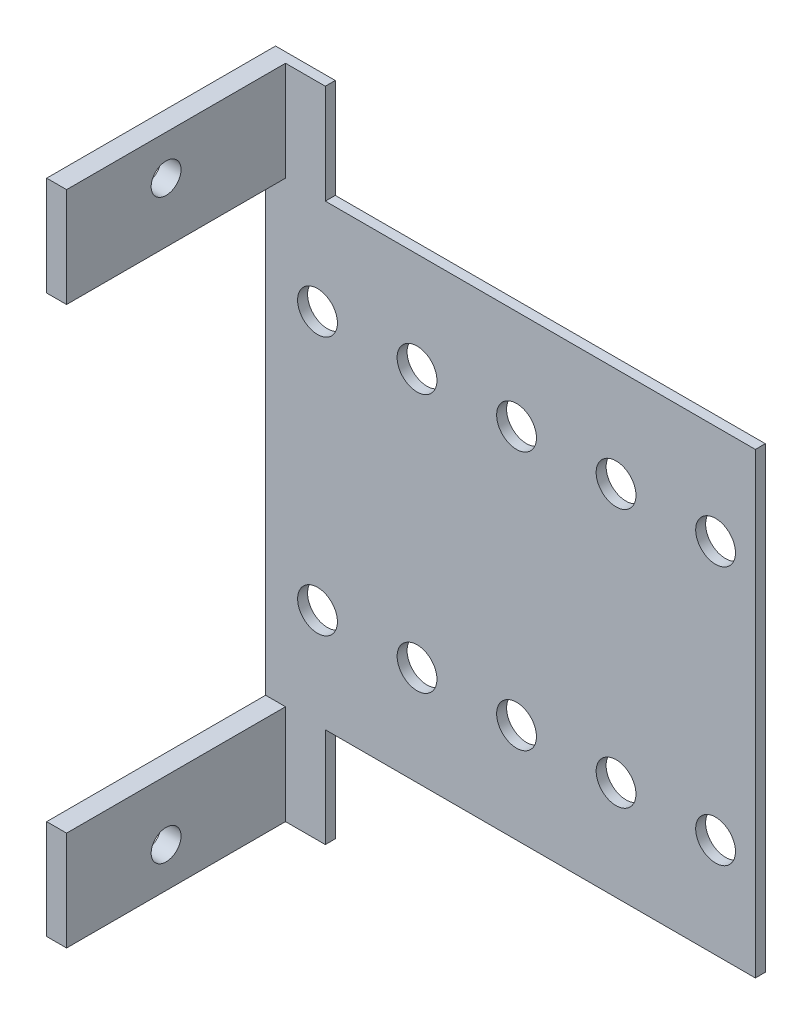
ISO-10303-21;
HEADER;
FILE_DESCRIPTION(('STEP AP214'),'2;1');
FILE_NAME('part.step','',(''),(''),'','','');
FILE_SCHEMA(('AUTOMOTIVE_DESIGN { 1 0 10303 214 1 1 1 1 }'));
ENDSEC;
DATA;
#1=APPLICATION_CONTEXT('core data for automotive mechanical design processes');
#2=APPLICATION_PROTOCOL_DEFINITION('international standard','automotive_design',2000,#1);
#3=PRODUCT_CONTEXT('',#1,'mechanical');
#4=PRODUCT('Part','Part','',(#3));
#5=PRODUCT_RELATED_PRODUCT_CATEGORY('part','',(#4));
#6=PRODUCT_DEFINITION_FORMATION('','',#4);
#7=PRODUCT_DEFINITION_CONTEXT('part definition',#1,'design');
#8=PRODUCT_DEFINITION('design','',#6,#7);
#9=PRODUCT_DEFINITION_SHAPE('','',#8);
#10=(LENGTH_UNIT() NAMED_UNIT(*) SI_UNIT(.MILLI.,.METRE.));
#11=(NAMED_UNIT(*) PLANE_ANGLE_UNIT() SI_UNIT($,.RADIAN.));
#12=(NAMED_UNIT(*) SI_UNIT($,.STERADIAN.) SOLID_ANGLE_UNIT());
#13=UNCERTAINTY_MEASURE_WITH_UNIT(LENGTH_MEASURE(1.E-05),#10,'distance_accuracy_value','');
#14=(GEOMETRIC_REPRESENTATION_CONTEXT(3) GLOBAL_UNCERTAINTY_ASSIGNED_CONTEXT((#13)) GLOBAL_UNIT_ASSIGNED_CONTEXT((#10,
#11,#12)) REPRESENTATION_CONTEXT('',''));
#15=CARTESIAN_POINT('',(0.,0.,0.));
#16=DIRECTION('',(0.,0.,1.));
#17=DIRECTION('',(1.,0.,0.));
#18=AXIS2_PLACEMENT_3D('',#15,#16,#17);
#19=CARTESIAN_POINT('',(0.,0.,0.5));
#20=DIRECTION('',(0.,0.,1.));
#21=DIRECTION('',(1.,0.,0.));
#22=AXIS2_PLACEMENT_3D('',#19,#20,#21);
#23=PLANE('',#22);
#24=CARTESIAN_POINT('',(22.6081435007467,23.,0.5));
#25=DIRECTION('',(0.,0.,1.));
#26=DIRECTION('',(-1.,0.,0.));
#27=AXIS2_PLACEMENT_3D('',#24,#25,#26);
#28=CIRCLE('',#27,1.);
#29=CARTESIAN_POINT('',(21.6081435007467,23.,0.5));
#30=VERTEX_POINT('',#29);
#31=EDGE_CURVE('E223',#30,#30,#28,.T.);
#32=ORIENTED_EDGE('',*,*,#31,.F.);
#33=EDGE_LOOP('',(#32));
#34=FACE_BOUND('',#33,.T.);
#35=CARTESIAN_POINT('',(17.6081435007467,23.,0.5));
#36=DIRECTION('',(0.,0.,1.));
#37=DIRECTION('',(-1.,0.,0.));
#38=AXIS2_PLACEMENT_3D('',#35,#36,#37);
#39=CIRCLE('',#38,1.);
#40=CARTESIAN_POINT('',(16.6081435007467,23.,0.5));
#41=VERTEX_POINT('',#40);
#42=EDGE_CURVE('E220',#41,#41,#39,.T.);
#43=ORIENTED_EDGE('',*,*,#42,.F.);
#44=EDGE_LOOP('',(#43));
#45=FACE_BOUND('',#44,.T.);
#46=CARTESIAN_POINT('',(12.6081435007467,23.0000000000001,0.5));
#47=DIRECTION('',(0.,0.,1.));
#48=DIRECTION('',(-1.,0.,0.));
#49=AXIS2_PLACEMENT_3D('',#46,#47,#48);
#50=CIRCLE('',#49,1.);
#51=CARTESIAN_POINT('',(11.6081435007467,23.0000000000001,0.5));
#52=VERTEX_POINT('',#51);
#53=EDGE_CURVE('E216',#52,#52,#50,.T.);
#54=ORIENTED_EDGE('',*,*,#53,.F.);
#55=EDGE_LOOP('',(#54));
#56=FACE_BOUND('',#55,.T.);
#57=CARTESIAN_POINT('',(7.60814350074672,23.0000000000001,0.5));
#58=DIRECTION('',(0.,0.,1.));
#59=DIRECTION('',(-1.,0.,0.));
#60=AXIS2_PLACEMENT_3D('',#57,#58,#59);
#61=CIRCLE('',#60,1.);
#62=CARTESIAN_POINT('',(6.60814350074672,23.0000000000001,0.5));
#63=VERTEX_POINT('',#62);
#64=EDGE_CURVE('E212',#63,#63,#61,.T.);
#65=ORIENTED_EDGE('',*,*,#64,.F.);
#66=EDGE_LOOP('',(#65));
#67=FACE_BOUND('',#66,.T.);
#68=CARTESIAN_POINT('',(2.60814350074672,9.99999999999986,0.5));
#69=DIRECTION('',(0.,0.,1.));
#70=DIRECTION('',(1.,0.,0.));
#71=AXIS2_PLACEMENT_3D('',#68,#69,#70);
#72=CIRCLE('',#71,1.);
#73=CARTESIAN_POINT('',(3.60814350074672,9.99999999999986,0.5));
#74=VERTEX_POINT('',#73);
#75=EDGE_CURVE('E208',#74,#74,#72,.T.);
#76=ORIENTED_EDGE('',*,*,#75,.F.);
#77=EDGE_LOOP('',(#76));
#78=FACE_BOUND('',#77,.T.);
#79=CARTESIAN_POINT('',(7.60814350074672,9.9999999999999,0.5));
#80=DIRECTION('',(0.,0.,1.));
#81=DIRECTION('',(1.,0.,0.));
#82=AXIS2_PLACEMENT_3D('',#79,#80,#81);
#83=CIRCLE('',#82,1.);
#84=CARTESIAN_POINT('',(8.60814350074672,9.9999999999999,0.5));
#85=VERTEX_POINT('',#84);
#86=EDGE_CURVE('E204',#85,#85,#83,.T.);
#87=ORIENTED_EDGE('',*,*,#86,.F.);
#88=EDGE_LOOP('',(#87));
#89=FACE_BOUND('',#88,.T.);
#90=CARTESIAN_POINT('',(12.6081435007467,9.99999999999993,0.5));
#91=DIRECTION('',(0.,0.,1.));
#92=DIRECTION('',(1.,0.,0.));
#93=AXIS2_PLACEMENT_3D('',#90,#91,#92);
#94=CIRCLE('',#93,1.);
#95=CARTESIAN_POINT('',(13.6081435007467,9.99999999999993,0.5));
#96=VERTEX_POINT('',#95);
#97=EDGE_CURVE('E200',#96,#96,#94,.T.);
#98=ORIENTED_EDGE('',*,*,#97,.F.);
#99=EDGE_LOOP('',(#98));
#100=FACE_BOUND('',#99,.T.);
#101=CARTESIAN_POINT('',(17.6081435007467,9.99999999999997,0.5));
#102=DIRECTION('',(0.,0.,1.));
#103=DIRECTION('',(1.,0.,0.));
#104=AXIS2_PLACEMENT_3D('',#101,#102,#103);
#105=CIRCLE('',#104,1.);
#106=CARTESIAN_POINT('',(18.6081435007467,9.99999999999997,0.5));
#107=VERTEX_POINT('',#106);
#108=EDGE_CURVE('E196',#107,#107,#105,.T.);
#109=ORIENTED_EDGE('',*,*,#108,.F.);
#110=EDGE_LOOP('',(#109));
#111=FACE_BOUND('',#110,.T.);
#112=CARTESIAN_POINT('',(2.60814350074672,23.0000000000001,0.5));
#113=DIRECTION('',(0.,0.,1.));
#114=DIRECTION('',(-1.,0.,0.));
#115=AXIS2_PLACEMENT_3D('',#112,#113,#114);
#116=CIRCLE('',#115,1.);
#117=CARTESIAN_POINT('',(1.60814350074672,23.0000000000001,0.5));
#118=VERTEX_POINT('',#117);
#119=EDGE_CURVE('E192',#118,#118,#116,.T.);
#120=ORIENTED_EDGE('',*,*,#119,.F.);
#121=EDGE_LOOP('',(#120));
#122=FACE_BOUND('',#121,.T.);
#123=CARTESIAN_POINT('',(22.6081435007467,10.,0.5));
#124=DIRECTION('',(0.,0.,1.));
#125=DIRECTION('',(1.,0.,0.));
#126=AXIS2_PLACEMENT_3D('',#123,#124,#125);
#127=CIRCLE('',#126,1.);
#128=CARTESIAN_POINT('',(23.6081435007467,10.,0.5));
#129=VERTEX_POINT('',#128);
#130=EDGE_CURVE('E188',#129,#129,#127,.T.);
#131=ORIENTED_EDGE('',*,*,#130,.F.);
#132=EDGE_LOOP('',(#131));
#133=FACE_BOUND('',#132,.T.);
#134=DIRECTION('',(1.,0.,0.));
#135=VECTOR('',#134,1.);
#136=CARTESIAN_POINT('',(0.,5.,0.5));
#137=LINE('',#136,#135);
#138=CARTESIAN_POINT('',(0.,5.,0.5));
#139=VERTEX_POINT('',#138);
#140=CARTESIAN_POINT('',(1.,5.,0.5));
#141=VERTEX_POINT('',#140);
#142=EDGE_CURVE('E51',#139,#141,#137,.T.);
#143=ORIENTED_EDGE('',*,*,#142,.T.);
#144=DIRECTION('',(0.,1.,0.));
#145=VECTOR('',#144,1.);
#146=CARTESIAN_POINT('',(1.,0.,0.5));
#147=LINE('',#146,#145);
#148=CARTESIAN_POINT('',(1.,0.,0.5));
#149=VERTEX_POINT('',#148);
#150=EDGE_CURVE('E56',#149,#141,#147,.T.);
#151=ORIENTED_EDGE('',*,*,#150,.F.);
#152=DIRECTION('',(1.,0.,0.));
#153=VECTOR('',#152,1.);
#154=CARTESIAN_POINT('',(0.,0.,0.5));
#155=LINE('',#154,#153);
#156=CARTESIAN_POINT('',(3.,0.,0.5));
#157=VERTEX_POINT('',#156);
#158=EDGE_CURVE('E158',#149,#157,#155,.T.);
#159=ORIENTED_EDGE('',*,*,#158,.T.);
#160=DIRECTION('',(0.,1.,0.));
#161=VECTOR('',#160,1.);
#162=CARTESIAN_POINT('',(3.,0.,0.5));
#163=LINE('',#162,#161);
#164=CARTESIAN_POINT('',(3.,5.,0.5));
#165=VERTEX_POINT('',#164);
#166=EDGE_CURVE('E412',#157,#165,#163,.T.);
#167=ORIENTED_EDGE('',*,*,#166,.T.);
#168=DIRECTION('',(1.,0.,0.));
#169=VECTOR('',#168,1.);
#170=CARTESIAN_POINT('',(3.,5.,0.5));
#171=LINE('',#170,#169);
#172=CARTESIAN_POINT('',(24.6081435007467,5.,0.5));
#173=VERTEX_POINT('',#172);
#174=EDGE_CURVE('E336',#165,#173,#171,.T.);
#175=ORIENTED_EDGE('',*,*,#174,.T.);
#176=DIRECTION('',(0.,1.,0.));
#177=VECTOR('',#176,1.);
#178=CARTESIAN_POINT('',(24.6081435007467,28.,0.5));
#179=LINE('',#178,#177);
#180=CARTESIAN_POINT('',(24.6081435007467,28.,0.5));
#181=VERTEX_POINT('',#180);
#182=EDGE_CURVE('E410',#173,#181,#179,.T.);
#183=ORIENTED_EDGE('',*,*,#182,.T.);
#184=DIRECTION('',(-1.,0.,0.));
#185=VECTOR('',#184,1.);
#186=CARTESIAN_POINT('',(3.,28.,0.5));
#187=LINE('',#186,#185);
#188=CARTESIAN_POINT('',(3.,28.,0.5));
#189=VERTEX_POINT('',#188);
#190=EDGE_CURVE('E407',#181,#189,#187,.T.);
#191=ORIENTED_EDGE('',*,*,#190,.T.);
#192=DIRECTION('',(0.,1.,0.));
#193=VECTOR('',#192,1.);
#194=CARTESIAN_POINT('',(3.,33.,0.5));
#195=LINE('',#194,#193);
#196=CARTESIAN_POINT('',(3.,33.,0.5));
#197=VERTEX_POINT('',#196);
#198=EDGE_CURVE('E372',#189,#197,#195,.T.);
#199=ORIENTED_EDGE('',*,*,#198,.T.);
#200=DIRECTION('',(-1.,0.,0.));
#201=VECTOR('',#200,1.);
#202=CARTESIAN_POINT('',(0.,33.,0.5));
#203=LINE('',#202,#201);
#204=CARTESIAN_POINT('',(1.,33.,0.5));
#205=VERTEX_POINT('',#204);
#206=EDGE_CURVE('E369',#197,#205,#203,.T.);
#207=ORIENTED_EDGE('',*,*,#206,.T.);
#208=DIRECTION('',(0.,-1.,0.));
#209=VECTOR('',#208,1.);
#210=CARTESIAN_POINT('',(1.,0.,0.5));
#211=LINE('',#210,#209);
#212=CARTESIAN_POINT('',(1.,28.,0.5));
#213=VERTEX_POINT('',#212);
#214=EDGE_CURVE('E159',#205,#213,#211,.T.);
#215=ORIENTED_EDGE('',*,*,#214,.T.);
#216=DIRECTION('',(1.,0.,0.));
#217=VECTOR('',#216,1.);
#218=CARTESIAN_POINT('',(0.,28.,0.5));
#219=LINE('',#218,#217);
#220=CARTESIAN_POINT('',(0.,28.,0.5));
#221=VERTEX_POINT('',#220);
#222=EDGE_CURVE('E161',#221,#213,#219,.T.);
#223=ORIENTED_EDGE('',*,*,#222,.F.);
#224=DIRECTION('',(0.,-1.,0.));
#225=VECTOR('',#224,1.);
#226=CARTESIAN_POINT('',(0.,0.,0.5));
#227=LINE('',#226,#225);
#228=EDGE_CURVE('E265',#221,#139,#227,.T.);
#229=ORIENTED_EDGE('',*,*,#228,.T.);
#230=EDGE_LOOP('',(#143,#151,#159,#167,#175,#183,#191,#199,#207,#215,#223,#229));
#231=FACE_BOUND('',#230,.T.);
#232=ADVANCED_FACE('F34',(#34,#45,#56,#67,#78,#89,#100,#111,#122,#133,#231),#23,.T.);
#233=CARTESIAN_POINT('',(0.,0.,0.5));
#234=DIRECTION('',(0.,1.,0.));
#235=DIRECTION('',(0.,0.,1.));
#236=AXIS2_PLACEMENT_3D('',#233,#234,#235);
#237=PLANE('',#236);
#238=DIRECTION('',(1.,0.,0.));
#239=VECTOR('',#238,1.);
#240=CARTESIAN_POINT('',(0.,0.,0.));
#241=LINE('',#240,#239);
#242=CARTESIAN_POINT('',(0.,0.,0.));
#243=VERTEX_POINT('',#242);
#244=CARTESIAN_POINT('',(3.,0.,0.));
#245=VERTEX_POINT('',#244);
#246=EDGE_CURVE('E332',#243,#245,#241,.T.);
#247=ORIENTED_EDGE('',*,*,#246,.T.);
#248=DIRECTION('',(0.,0.,-1.));
#249=VECTOR('',#248,1.);
#250=CARTESIAN_POINT('',(3.,0.,0.5));
#251=LINE('',#250,#249);
#252=EDGE_CURVE('E11',#157,#245,#251,.T.);
#253=ORIENTED_EDGE('',*,*,#252,.F.);
#254=ORIENTED_EDGE('',*,*,#158,.F.);
#255=DIRECTION('',(0.,0.,-1.));
#256=VECTOR('',#255,1.);
#257=CARTESIAN_POINT('',(1.,0.,11.5));
#258=LINE('',#257,#256);
#259=CARTESIAN_POINT('',(1.,0.,11.5));
#260=VERTEX_POINT('',#259);
#261=EDGE_CURVE('E140',#260,#149,#258,.T.);
#262=ORIENTED_EDGE('',*,*,#261,.F.);
#263=DIRECTION('',(1.,0.,0.));
#264=VECTOR('',#263,1.);
#265=CARTESIAN_POINT('',(0.,0.,11.5));
#266=LINE('',#265,#264);
#267=CARTESIAN_POINT('',(0.,0.,11.5));
#268=VERTEX_POINT('',#267);
#269=EDGE_CURVE('E146',#268,#260,#266,.T.);
#270=ORIENTED_EDGE('',*,*,#269,.F.);
#271=DIRECTION('',(0.,0.,-1.));
#272=VECTOR('',#271,1.);
#273=CARTESIAN_POINT('',(0.,0.,0.5));
#274=LINE('',#273,#272);
#275=EDGE_CURVE('E354',#268,#243,#274,.T.);
#276=ORIENTED_EDGE('',*,*,#275,.T.);
#277=EDGE_LOOP('',(#247,#253,#254,#262,#270,#276));
#278=FACE_BOUND('',#277,.T.);
#279=ADVANCED_FACE('F36',(#278),#237,.F.);
#280=CARTESIAN_POINT('',(3.,0.,0.5));
#281=DIRECTION('',(-1.,0.,0.));
#282=DIRECTION('',(0.,0.,1.));
#283=AXIS2_PLACEMENT_3D('',#280,#281,#282);
#284=PLANE('',#283);
#285=DIRECTION('',(0.,1.,0.));
#286=VECTOR('',#285,1.);
#287=CARTESIAN_POINT('',(3.,0.,0.));
#288=LINE('',#287,#286);
#289=CARTESIAN_POINT('',(3.,5.,0.));
#290=VERTEX_POINT('',#289);
#291=EDGE_CURVE('E324',#245,#290,#288,.T.);
#292=ORIENTED_EDGE('',*,*,#291,.T.);
#293=DIRECTION('',(0.,0.,-1.));
#294=VECTOR('',#293,1.);
#295=CARTESIAN_POINT('',(3.,5.,0.5));
#296=LINE('',#295,#294);
#297=EDGE_CURVE('E43',#165,#290,#296,.T.);
#298=ORIENTED_EDGE('',*,*,#297,.F.);
#299=ORIENTED_EDGE('',*,*,#166,.F.);
#300=ORIENTED_EDGE('',*,*,#252,.T.);
#301=EDGE_LOOP('',(#292,#298,#299,#300));
#302=FACE_BOUND('',#301,.T.);
#303=ADVANCED_FACE('F286',(#302),#284,.F.);
#304=CARTESIAN_POINT('',(3.,5.,0.5));
#305=DIRECTION('',(0.,1.,0.));
#306=DIRECTION('',(0.,0.,1.));
#307=AXIS2_PLACEMENT_3D('',#304,#305,#306);
#308=PLANE('',#307);
#309=DIRECTION('',(1.,0.,0.));
#310=VECTOR('',#309,1.);
#311=CARTESIAN_POINT('',(3.,5.,0.));
#312=LINE('',#311,#310);
#313=CARTESIAN_POINT('',(24.6081435007467,5.,0.));
#314=VERTEX_POINT('',#313);
#315=EDGE_CURVE('E331',#290,#314,#312,.T.);
#316=ORIENTED_EDGE('',*,*,#315,.T.);
#317=DIRECTION('',(0.,0.,-1.));
#318=VECTOR('',#317,1.);
#319=CARTESIAN_POINT('',(24.6081435007467,5.,0.5));
#320=LINE('',#319,#318);
#321=EDGE_CURVE('E337',#173,#314,#320,.T.);
#322=ORIENTED_EDGE('',*,*,#321,.F.);
#323=ORIENTED_EDGE('',*,*,#174,.F.);
#324=ORIENTED_EDGE('',*,*,#297,.T.);
#325=EDGE_LOOP('',(#316,#322,#323,#324));
#326=FACE_BOUND('',#325,.T.);
#327=ADVANCED_FACE('F315',(#326),#308,.F.);
#328=CARTESIAN_POINT('',(24.6081435007467,28.,0.5));
#329=DIRECTION('',(-1.,0.,0.));
#330=DIRECTION('',(0.,0.,1.));
#331=AXIS2_PLACEMENT_3D('',#328,#329,#330);
#332=PLANE('',#331);
#333=DIRECTION('',(0.,1.,0.));
#334=VECTOR('',#333,1.);
#335=CARTESIAN_POINT('',(24.6081435007467,28.,0.));
#336=LINE('',#335,#334);
#337=CARTESIAN_POINT('',(24.6081435007467,28.,0.));
#338=VERTEX_POINT('',#337);
#339=EDGE_CURVE('E341',#314,#338,#336,.T.);
#340=ORIENTED_EDGE('',*,*,#339,.T.);
#341=DIRECTION('',(0.,0.,-1.));
#342=VECTOR('',#341,1.);
#343=CARTESIAN_POINT('',(24.6081435007467,28.,0.5));
#344=LINE('',#343,#342);
#345=EDGE_CURVE('E365',#181,#338,#344,.T.);
#346=ORIENTED_EDGE('',*,*,#345,.F.);
#347=ORIENTED_EDGE('',*,*,#182,.F.);
#348=ORIENTED_EDGE('',*,*,#321,.T.);
#349=EDGE_LOOP('',(#340,#346,#347,#348));
#350=FACE_BOUND('',#349,.T.);
#351=ADVANCED_FACE('F311',(#350),#332,.F.);
#352=CARTESIAN_POINT('',(3.,28.,0.5));
#353=DIRECTION('',(0.,-1.,0.));
#354=DIRECTION('',(0.,0.,-1.));
#355=AXIS2_PLACEMENT_3D('',#352,#353,#354);
#356=PLANE('',#355);
#357=DIRECTION('',(-1.,0.,0.));
#358=VECTOR('',#357,1.);
#359=CARTESIAN_POINT('',(3.,28.,0.));
#360=LINE('',#359,#358);
#361=CARTESIAN_POINT('',(3.,28.,0.));
#362=VERTEX_POINT('',#361);
#363=EDGE_CURVE('E343',#338,#362,#360,.T.);
#364=ORIENTED_EDGE('',*,*,#363,.T.);
#365=DIRECTION('',(0.,0.,-1.));
#366=VECTOR('',#365,1.);
#367=CARTESIAN_POINT('',(3.,28.,0.5));
#368=LINE('',#367,#366);
#369=EDGE_CURVE('E362',#189,#362,#368,.T.);
#370=ORIENTED_EDGE('',*,*,#369,.F.);
#371=ORIENTED_EDGE('',*,*,#190,.F.);
#372=ORIENTED_EDGE('',*,*,#345,.T.);
#373=EDGE_LOOP('',(#364,#370,#371,#372));
#374=FACE_BOUND('',#373,.T.);
#375=ADVANCED_FACE('F307',(#374),#356,.F.);
#376=CARTESIAN_POINT('',(3.,33.,0.5));
#377=DIRECTION('',(-1.,0.,0.));
#378=DIRECTION('',(0.,0.,1.));
#379=AXIS2_PLACEMENT_3D('',#376,#377,#378);
#380=PLANE('',#379);
#381=DIRECTION('',(0.,1.,0.));
#382=VECTOR('',#381,1.);
#383=CARTESIAN_POINT('',(3.,33.,0.));
#384=LINE('',#383,#382);
#385=CARTESIAN_POINT('',(3.,33.,0.));
#386=VERTEX_POINT('',#385);
#387=EDGE_CURVE('E348',#362,#386,#384,.T.);
#388=ORIENTED_EDGE('',*,*,#387,.T.);
#389=DIRECTION('',(0.,0.,-1.));
#390=VECTOR('',#389,1.);
#391=CARTESIAN_POINT('',(3.,33.,0.5));
#392=LINE('',#391,#390);
#393=EDGE_CURVE('E359',#197,#386,#392,.T.);
#394=ORIENTED_EDGE('',*,*,#393,.F.);
#395=ORIENTED_EDGE('',*,*,#198,.F.);
#396=ORIENTED_EDGE('',*,*,#369,.T.);
#397=EDGE_LOOP('',(#388,#394,#395,#396));
#398=FACE_BOUND('',#397,.T.);
#399=ADVANCED_FACE('F303',(#398),#380,.F.);
#400=CARTESIAN_POINT('',(0.,33.,0.5));
#401=DIRECTION('',(0.,-1.,0.));
#402=DIRECTION('',(0.,0.,-1.));
#403=AXIS2_PLACEMENT_3D('',#400,#401,#402);
#404=PLANE('',#403);
#405=DIRECTION('',(-1.,0.,0.));
#406=VECTOR('',#405,1.);
#407=CARTESIAN_POINT('',(0.,33.,0.));
#408=LINE('',#407,#406);
#409=CARTESIAN_POINT('',(0.,33.,0.));
#410=VERTEX_POINT('',#409);
#411=EDGE_CURVE('E350',#386,#410,#408,.T.);
#412=ORIENTED_EDGE('',*,*,#411,.T.);
#413=DIRECTION('',(0.,0.,-1.));
#414=VECTOR('',#413,1.);
#415=CARTESIAN_POINT('',(0.,33.,0.5));
#416=LINE('',#415,#414);
#417=CARTESIAN_POINT('',(0.,33.,11.5));
#418=VERTEX_POINT('',#417);
#419=EDGE_CURVE('E356',#418,#410,#416,.T.);
#420=ORIENTED_EDGE('',*,*,#419,.F.);
#421=DIRECTION('',(-1.,0.,0.));
#422=VECTOR('',#421,1.);
#423=CARTESIAN_POINT('',(0.,33.,11.5));
#424=LINE('',#423,#422);
#425=CARTESIAN_POINT('',(1.,33.,11.5));
#426=VERTEX_POINT('',#425);
#427=EDGE_CURVE('E170',#426,#418,#424,.T.);
#428=ORIENTED_EDGE('',*,*,#427,.F.);
#429=DIRECTION('',(0.,0.,-1.));
#430=VECTOR('',#429,1.);
#431=CARTESIAN_POINT('',(1.,33.,11.5));
#432=LINE('',#431,#430);
#433=EDGE_CURVE('E379',#426,#205,#432,.T.);
#434=ORIENTED_EDGE('',*,*,#433,.T.);
#435=ORIENTED_EDGE('',*,*,#206,.F.);
#436=ORIENTED_EDGE('',*,*,#393,.T.);
#437=EDGE_LOOP('',(#412,#420,#428,#434,#435,#436));
#438=FACE_BOUND('',#437,.T.);
#439=ADVANCED_FACE('F299',(#438),#404,.F.);
#440=CARTESIAN_POINT('',(0.,0.,0.5));
#441=DIRECTION('',(1.,0.,0.));
#442=DIRECTION('',(0.,0.,-1.));
#443=AXIS2_PLACEMENT_3D('',#440,#441,#442);
#444=PLANE('',#443);
#445=CARTESIAN_POINT('',(0.,2.,6.5));
#446=DIRECTION('',(-1.,0.,0.));
#447=DIRECTION('',(0.,0.,-1.));
#448=AXIS2_PLACEMENT_3D('',#445,#446,#447);
#449=CIRCLE('',#448,0.75);
#450=CARTESIAN_POINT('',(0.,2.,5.75));
#451=VERTEX_POINT('',#450);
#452=EDGE_CURVE('E236',#451,#451,#449,.T.);
#453=ORIENTED_EDGE('',*,*,#452,.F.);
#454=EDGE_LOOP('',(#453));
#455=FACE_BOUND('',#454,.T.);
#456=CARTESIAN_POINT('',(0.,31.,6.5));
#457=DIRECTION('',(-1.,0.,0.));
#458=DIRECTION('',(0.,0.,1.));
#459=AXIS2_PLACEMENT_3D('',#456,#457,#458);
#460=CIRCLE('',#459,0.75);
#461=CARTESIAN_POINT('',(0.,31.,7.25));
#462=VERTEX_POINT('',#461);
#463=EDGE_CURVE('E226',#462,#462,#460,.T.);
#464=ORIENTED_EDGE('',*,*,#463,.F.);
#465=EDGE_LOOP('',(#464));
#466=FACE_BOUND('',#465,.T.);
#467=DIRECTION('',(0.,-1.,0.));
#468=VECTOR('',#467,1.);
#469=CARTESIAN_POINT('',(0.,0.,0.));
#470=LINE('',#469,#468);
#471=EDGE_CURVE('E352',#410,#243,#470,.T.);
#472=ORIENTED_EDGE('',*,*,#471,.T.);
#473=ORIENTED_EDGE('',*,*,#275,.F.);
#474=DIRECTION('',(0.,-1.,0.));
#475=VECTOR('',#474,1.);
#476=CARTESIAN_POINT('',(0.,0.,11.5));
#477=LINE('',#476,#475);
#478=CARTESIAN_POINT('',(0.,5.,11.5));
#479=VERTEX_POINT('',#478);
#480=EDGE_CURVE('E152',#479,#268,#477,.T.);
#481=ORIENTED_EDGE('',*,*,#480,.F.);
#482=DIRECTION('',(0.,0.,-1.));
#483=VECTOR('',#482,1.);
#484=CARTESIAN_POINT('',(0.,5.,11.5));
#485=LINE('',#484,#483);
#486=EDGE_CURVE('E163',#479,#139,#485,.T.);
#487=ORIENTED_EDGE('',*,*,#486,.T.);
#488=ORIENTED_EDGE('',*,*,#228,.F.);
#489=DIRECTION('',(0.,0.,-1.));
#490=VECTOR('',#489,1.);
#491=CARTESIAN_POINT('',(0.,28.,11.5));
#492=LINE('',#491,#490);
#493=CARTESIAN_POINT('',(0.,28.,11.5));
#494=VERTEX_POINT('',#493);
#495=EDGE_CURVE('E381',#494,#221,#492,.T.);
#496=ORIENTED_EDGE('',*,*,#495,.F.);
#497=DIRECTION('',(0.,-1.,0.));
#498=VECTOR('',#497,1.);
#499=CARTESIAN_POINT('',(0.,0.,11.5));
#500=LINE('',#499,#498);
#501=EDGE_CURVE('E173',#418,#494,#500,.T.);
#502=ORIENTED_EDGE('',*,*,#501,.F.);
#503=ORIENTED_EDGE('',*,*,#419,.T.);
#504=EDGE_LOOP('',(#472,#473,#481,#487,#488,#496,#502,#503));
#505=FACE_BOUND('',#504,.T.);
#506=ADVANCED_FACE('F263',(#455,#466,#505),#444,.F.);
#507=CARTESIAN_POINT('',(0.,0.,0.));
#508=DIRECTION('',(0.,0.,1.));
#509=DIRECTION('',(1.,0.,0.));
#510=AXIS2_PLACEMENT_3D('',#507,#508,#509);
#511=PLANE('',#510);
#512=CARTESIAN_POINT('',(22.6081435007467,23.,0.));
#513=DIRECTION('',(0.,0.,1.));
#514=DIRECTION('',(1.,0.,0.));
#515=AXIS2_PLACEMENT_3D('',#512,#513,#514);
#516=CIRCLE('',#515,1.);
#517=CARTESIAN_POINT('',(23.6081435007467,23.,0.));
#518=VERTEX_POINT('',#517);
#519=EDGE_CURVE('E221',#518,#518,#516,.T.);
#520=ORIENTED_EDGE('',*,*,#519,.T.);
#521=EDGE_LOOP('',(#520));
#522=FACE_BOUND('',#521,.T.);
#523=CARTESIAN_POINT('',(17.6081435007467,23.,0.));
#524=DIRECTION('',(0.,0.,1.));
#525=DIRECTION('',(1.,0.,0.));
#526=AXIS2_PLACEMENT_3D('',#523,#524,#525);
#527=CIRCLE('',#526,1.);
#528=CARTESIAN_POINT('',(18.6081435007467,23.,0.));
#529=VERTEX_POINT('',#528);
#530=EDGE_CURVE('E217',#529,#529,#527,.T.);
#531=ORIENTED_EDGE('',*,*,#530,.T.);
#532=EDGE_LOOP('',(#531));
#533=FACE_BOUND('',#532,.T.);
#534=CARTESIAN_POINT('',(12.6081435007467,23.0000000000001,0.));
#535=DIRECTION('',(0.,0.,1.));
#536=DIRECTION('',(1.,0.,0.));
#537=AXIS2_PLACEMENT_3D('',#534,#535,#536);
#538=CIRCLE('',#537,1.);
#539=CARTESIAN_POINT('',(13.6081435007467,23.0000000000001,0.));
#540=VERTEX_POINT('',#539);
#541=EDGE_CURVE('E213',#540,#540,#538,.T.);
#542=ORIENTED_EDGE('',*,*,#541,.T.);
#543=EDGE_LOOP('',(#542));
#544=FACE_BOUND('',#543,.T.);
#545=CARTESIAN_POINT('',(7.60814350074672,23.0000000000001,0.));
#546=DIRECTION('',(0.,0.,1.));
#547=DIRECTION('',(1.,0.,0.));
#548=AXIS2_PLACEMENT_3D('',#545,#546,#547);
#549=CIRCLE('',#548,1.);
#550=CARTESIAN_POINT('',(8.60814350074672,23.0000000000001,0.));
#551=VERTEX_POINT('',#550);
#552=EDGE_CURVE('E209',#551,#551,#549,.T.);
#553=ORIENTED_EDGE('',*,*,#552,.T.);
#554=EDGE_LOOP('',(#553));
#555=FACE_BOUND('',#554,.T.);
#556=CARTESIAN_POINT('',(2.60814350074672,9.99999999999986,0.));
#557=DIRECTION('',(0.,0.,1.));
#558=DIRECTION('',(1.,0.,0.));
#559=AXIS2_PLACEMENT_3D('',#556,#557,#558);
#560=CIRCLE('',#559,1.);
#561=CARTESIAN_POINT('',(3.60814350074672,9.99999999999986,0.));
#562=VERTEX_POINT('',#561);
#563=EDGE_CURVE('E205',#562,#562,#560,.T.);
#564=ORIENTED_EDGE('',*,*,#563,.T.);
#565=EDGE_LOOP('',(#564));
#566=FACE_BOUND('',#565,.T.);
#567=CARTESIAN_POINT('',(7.60814350074672,9.9999999999999,0.));
#568=DIRECTION('',(0.,0.,1.));
#569=DIRECTION('',(1.,0.,0.));
#570=AXIS2_PLACEMENT_3D('',#567,#568,#569);
#571=CIRCLE('',#570,1.);
#572=CARTESIAN_POINT('',(8.60814350074672,9.9999999999999,0.));
#573=VERTEX_POINT('',#572);
#574=EDGE_CURVE('E201',#573,#573,#571,.T.);
#575=ORIENTED_EDGE('',*,*,#574,.T.);
#576=EDGE_LOOP('',(#575));
#577=FACE_BOUND('',#576,.T.);
#578=CARTESIAN_POINT('',(12.6081435007467,9.99999999999993,0.));
#579=DIRECTION('',(0.,0.,1.));
#580=DIRECTION('',(1.,0.,0.));
#581=AXIS2_PLACEMENT_3D('',#578,#579,#580);
#582=CIRCLE('',#581,1.);
#583=CARTESIAN_POINT('',(13.6081435007467,9.99999999999993,0.));
#584=VERTEX_POINT('',#583);
#585=EDGE_CURVE('E197',#584,#584,#582,.T.);
#586=ORIENTED_EDGE('',*,*,#585,.T.);
#587=EDGE_LOOP('',(#586));
#588=FACE_BOUND('',#587,.T.);
#589=CARTESIAN_POINT('',(17.6081435007467,9.99999999999997,0.));
#590=DIRECTION('',(0.,0.,1.));
#591=DIRECTION('',(1.,0.,0.));
#592=AXIS2_PLACEMENT_3D('',#589,#590,#591);
#593=CIRCLE('',#592,1.);
#594=CARTESIAN_POINT('',(18.6081435007467,9.99999999999997,0.));
#595=VERTEX_POINT('',#594);
#596=EDGE_CURVE('E193',#595,#595,#593,.T.);
#597=ORIENTED_EDGE('',*,*,#596,.T.);
#598=EDGE_LOOP('',(#597));
#599=FACE_BOUND('',#598,.T.);
#600=CARTESIAN_POINT('',(2.60814350074672,23.0000000000001,0.));
#601=DIRECTION('',(0.,0.,1.));
#602=DIRECTION('',(1.,0.,0.));
#603=AXIS2_PLACEMENT_3D('',#600,#601,#602);
#604=CIRCLE('',#603,1.);
#605=CARTESIAN_POINT('',(3.60814350074672,23.0000000000001,0.));
#606=VERTEX_POINT('',#605);
#607=EDGE_CURVE('E189',#606,#606,#604,.T.);
#608=ORIENTED_EDGE('',*,*,#607,.T.);
#609=EDGE_LOOP('',(#608));
#610=FACE_BOUND('',#609,.T.);
#611=CARTESIAN_POINT('',(22.6081435007467,10.,0.));
#612=DIRECTION('',(0.,0.,1.));
#613=DIRECTION('',(1.,0.,0.));
#614=AXIS2_PLACEMENT_3D('',#611,#612,#613);
#615=CIRCLE('',#614,1.);
#616=CARTESIAN_POINT('',(23.6081435007467,10.,0.));
#617=VERTEX_POINT('',#616);
#618=EDGE_CURVE('E185',#617,#617,#615,.T.);
#619=ORIENTED_EDGE('',*,*,#618,.T.);
#620=EDGE_LOOP('',(#619));
#621=FACE_BOUND('',#620,.T.);
#622=ORIENTED_EDGE('',*,*,#246,.F.);
#623=ORIENTED_EDGE('',*,*,#471,.F.);
#624=ORIENTED_EDGE('',*,*,#411,.F.);
#625=ORIENTED_EDGE('',*,*,#387,.F.);
#626=ORIENTED_EDGE('',*,*,#363,.F.);
#627=ORIENTED_EDGE('',*,*,#339,.F.);
#628=ORIENTED_EDGE('',*,*,#315,.F.);
#629=ORIENTED_EDGE('',*,*,#291,.F.);
#630=EDGE_LOOP('',(#622,#623,#624,#625,#626,#627,#628,#629));
#631=FACE_BOUND('',#630,.T.);
#632=ADVANCED_FACE('F293',(#522,#533,#544,#555,#566,#577,#588,#599,#610,#621,#631),#511,.F.);
#633=CARTESIAN_POINT('',(1.,0.,11.5));
#634=DIRECTION('',(1.,0.,0.));
#635=DIRECTION('',(0.,1.,0.));
#636=AXIS2_PLACEMENT_3D('',#633,#634,#635);
#637=PLANE('',#636);
#638=CARTESIAN_POINT('',(1.,31.,6.5));
#639=DIRECTION('',(1.,0.,0.));
#640=DIRECTION('',(0.,1.,0.));
#641=AXIS2_PLACEMENT_3D('',#638,#639,#640);
#642=CIRCLE('',#641,0.75);
#643=CARTESIAN_POINT('',(1.,31.75,6.5));
#644=VERTEX_POINT('',#643);
#645=EDGE_CURVE('E224',#644,#644,#642,.T.);
#646=ORIENTED_EDGE('',*,*,#645,.F.);
#647=EDGE_LOOP('',(#646));
#648=FACE_BOUND('',#647,.T.);
#649=ORIENTED_EDGE('',*,*,#214,.F.);
#650=ORIENTED_EDGE('',*,*,#433,.F.);
#651=DIRECTION('',(0.,-1.,0.));
#652=VECTOR('',#651,1.);
#653=CARTESIAN_POINT('',(1.,0.,11.5));
#654=LINE('',#653,#652);
#655=CARTESIAN_POINT('',(1.,28.,11.5));
#656=VERTEX_POINT('',#655);
#657=EDGE_CURVE('E167',#426,#656,#654,.T.);
#658=ORIENTED_EDGE('',*,*,#657,.T.);
#659=DIRECTION('',(0.,0.,-1.));
#660=VECTOR('',#659,1.);
#661=CARTESIAN_POINT('',(1.,28.,11.5));
#662=LINE('',#661,#660);
#663=EDGE_CURVE('E177',#656,#213,#662,.T.);
#664=ORIENTED_EDGE('',*,*,#663,.T.);
#665=EDGE_LOOP('',(#649,#650,#658,#664));
#666=FACE_BOUND('',#665,.T.);
#667=ADVANCED_FACE('F291',(#648,#666),#637,.T.);
#668=CARTESIAN_POINT('',(0.,28.,11.5));
#669=DIRECTION('',(0.,1.,0.));
#670=DIRECTION('',(0.,0.,1.));
#671=AXIS2_PLACEMENT_3D('',#668,#669,#670);
#672=PLANE('',#671);
#673=ORIENTED_EDGE('',*,*,#222,.T.);
#674=ORIENTED_EDGE('',*,*,#663,.F.);
#675=DIRECTION('',(1.,0.,0.));
#676=VECTOR('',#675,1.);
#677=CARTESIAN_POINT('',(0.,28.,11.5));
#678=LINE('',#677,#676);
#679=EDGE_CURVE('E175',#494,#656,#678,.T.);
#680=ORIENTED_EDGE('',*,*,#679,.F.);
#681=ORIENTED_EDGE('',*,*,#495,.T.);
#682=EDGE_LOOP('',(#673,#674,#680,#681));
#683=FACE_BOUND('',#682,.T.);
#684=ADVANCED_FACE('F393',(#683),#672,.F.);
#685=CARTESIAN_POINT('',(0.,0.,11.5));
#686=DIRECTION('',(0.,0.,1.));
#687=DIRECTION('',(1.,0.,0.));
#688=AXIS2_PLACEMENT_3D('',#685,#686,#687);
#689=PLANE('',#688);
#690=ORIENTED_EDGE('',*,*,#657,.F.);
#691=ORIENTED_EDGE('',*,*,#427,.T.);
#692=ORIENTED_EDGE('',*,*,#501,.T.);
#693=ORIENTED_EDGE('',*,*,#679,.T.);
#694=EDGE_LOOP('',(#690,#691,#692,#693));
#695=FACE_BOUND('',#694,.T.);
#696=ADVANCED_FACE('F277',(#695),#689,.T.);
#697=CARTESIAN_POINT('',(1.,0.,11.5));
#698=DIRECTION('',(-1.,0.,0.));
#699=DIRECTION('',(0.,-1.,0.));
#700=AXIS2_PLACEMENT_3D('',#697,#698,#699);
#701=PLANE('',#700);
#702=CARTESIAN_POINT('',(1.,2.,6.5));
#703=DIRECTION('',(-1.,0.,0.));
#704=DIRECTION('',(0.,-1.,0.));
#705=AXIS2_PLACEMENT_3D('',#702,#703,#704);
#706=CIRCLE('',#705,0.75);
#707=CARTESIAN_POINT('',(1.,1.25,6.5));
#708=VERTEX_POINT('',#707);
#709=EDGE_CURVE('E38',#708,#708,#706,.T.);
#710=ORIENTED_EDGE('',*,*,#709,.T.);
#711=EDGE_LOOP('',(#710));
#712=FACE_BOUND('',#711,.T.);
#713=ORIENTED_EDGE('',*,*,#150,.T.);
#714=DIRECTION('',(0.,0.,-1.));
#715=VECTOR('',#714,1.);
#716=CARTESIAN_POINT('',(1.,5.,11.5));
#717=LINE('',#716,#715);
#718=CARTESIAN_POINT('',(1.,5.,11.5));
#719=VERTEX_POINT('',#718);
#720=EDGE_CURVE('E141',#719,#141,#717,.T.);
#721=ORIENTED_EDGE('',*,*,#720,.F.);
#722=DIRECTION('',(0.,1.,0.));
#723=VECTOR('',#722,1.);
#724=CARTESIAN_POINT('',(1.,0.,11.5));
#725=LINE('',#724,#723);
#726=EDGE_CURVE('E136',#260,#719,#725,.T.);
#727=ORIENTED_EDGE('',*,*,#726,.F.);
#728=ORIENTED_EDGE('',*,*,#261,.T.);
#729=EDGE_LOOP('',(#713,#721,#727,#728));
#730=FACE_BOUND('',#729,.T.);
#731=ADVANCED_FACE('F138',(#712,#730),#701,.F.);
#732=CARTESIAN_POINT('',(0.,5.,11.5));
#733=DIRECTION('',(0.,1.,0.));
#734=DIRECTION('',(0.,0.,1.));
#735=AXIS2_PLACEMENT_3D('',#732,#733,#734);
#736=PLANE('',#735);
#737=ORIENTED_EDGE('',*,*,#142,.F.);
#738=ORIENTED_EDGE('',*,*,#486,.F.);
#739=DIRECTION('',(1.,0.,0.));
#740=VECTOR('',#739,1.);
#741=CARTESIAN_POINT('',(0.,5.,11.5));
#742=LINE('',#741,#740);
#743=EDGE_CURVE('E145',#479,#719,#742,.T.);
#744=ORIENTED_EDGE('',*,*,#743,.T.);
#745=ORIENTED_EDGE('',*,*,#720,.T.);
#746=EDGE_LOOP('',(#737,#738,#744,#745));
#747=FACE_BOUND('',#746,.T.);
#748=ADVANCED_FACE('F268',(#747),#736,.T.);
#749=CARTESIAN_POINT('',(0.,0.,11.5));
#750=DIRECTION('',(0.,0.,1.));
#751=DIRECTION('',(1.,0.,0.));
#752=AXIS2_PLACEMENT_3D('',#749,#750,#751);
#753=PLANE('',#752);
#754=ORIENTED_EDGE('',*,*,#269,.T.);
#755=ORIENTED_EDGE('',*,*,#726,.T.);
#756=ORIENTED_EDGE('',*,*,#743,.F.);
#757=ORIENTED_EDGE('',*,*,#480,.T.);
#758=EDGE_LOOP('',(#754,#755,#756,#757));
#759=FACE_BOUND('',#758,.T.);
#760=ADVANCED_FACE('F150',(#759),#753,.T.);
#761=CARTESIAN_POINT('',(22.6081435007467,10.,-10.5));
#762=DIRECTION('',(0.,0.,1.));
#763=DIRECTION('',(1.,0.,0.));
#764=AXIS2_PLACEMENT_3D('',#761,#762,#763);
#765=CYLINDRICAL_SURFACE('',#764,1.);
#766=ORIENTED_EDGE('',*,*,#130,.T.);
#767=EDGE_LOOP('',(#766));
#768=FACE_BOUND('',#767,.T.);
#769=ORIENTED_EDGE('',*,*,#618,.F.);
#770=EDGE_LOOP('',(#769));
#771=FACE_BOUND('',#770,.T.);
#772=ADVANCED_FACE('F275',(#768,#771),#765,.F.);
#773=CARTESIAN_POINT('',(2.60814350074672,23.0000000000001,-10.5));
#774=DIRECTION('',(0.,0.,1.));
#775=DIRECTION('',(1.,0.,0.));
#776=AXIS2_PLACEMENT_3D('',#773,#774,#775);
#777=CYLINDRICAL_SURFACE('',#776,1.);
#778=ORIENTED_EDGE('',*,*,#119,.T.);
#779=EDGE_LOOP('',(#778));
#780=FACE_BOUND('',#779,.T.);
#781=ORIENTED_EDGE('',*,*,#607,.F.);
#782=EDGE_LOOP('',(#781));
#783=FACE_BOUND('',#782,.T.);
#784=ADVANCED_FACE('F538',(#780,#783),#777,.F.);
#785=CARTESIAN_POINT('',(17.6081435007467,9.99999999999997,-10.5));
#786=DIRECTION('',(0.,0.,1.));
#787=DIRECTION('',(1.,0.,0.));
#788=AXIS2_PLACEMENT_3D('',#785,#786,#787);
#789=CYLINDRICAL_SURFACE('',#788,1.);
#790=ORIENTED_EDGE('',*,*,#108,.T.);
#791=EDGE_LOOP('',(#790));
#792=FACE_BOUND('',#791,.T.);
#793=ORIENTED_EDGE('',*,*,#596,.F.);
#794=EDGE_LOOP('',(#793));
#795=FACE_BOUND('',#794,.T.);
#796=ADVANCED_FACE('F547',(#792,#795),#789,.F.);
#797=CARTESIAN_POINT('',(12.6081435007467,9.99999999999993,-10.5));
#798=DIRECTION('',(0.,0.,1.));
#799=DIRECTION('',(1.,0.,0.));
#800=AXIS2_PLACEMENT_3D('',#797,#798,#799);
#801=CYLINDRICAL_SURFACE('',#800,1.);
#802=ORIENTED_EDGE('',*,*,#97,.T.);
#803=EDGE_LOOP('',(#802));
#804=FACE_BOUND('',#803,.T.);
#805=ORIENTED_EDGE('',*,*,#585,.F.);
#806=EDGE_LOOP('',(#805));
#807=FACE_BOUND('',#806,.T.);
#808=ADVANCED_FACE('F556',(#804,#807),#801,.F.);
#809=CARTESIAN_POINT('',(7.60814350074672,9.9999999999999,-10.5));
#810=DIRECTION('',(0.,0.,1.));
#811=DIRECTION('',(1.,0.,0.));
#812=AXIS2_PLACEMENT_3D('',#809,#810,#811);
#813=CYLINDRICAL_SURFACE('',#812,1.);
#814=ORIENTED_EDGE('',*,*,#86,.T.);
#815=EDGE_LOOP('',(#814));
#816=FACE_BOUND('',#815,.T.);
#817=ORIENTED_EDGE('',*,*,#574,.F.);
#818=EDGE_LOOP('',(#817));
#819=FACE_BOUND('',#818,.T.);
#820=ADVANCED_FACE('F565',(#816,#819),#813,.F.);
#821=CARTESIAN_POINT('',(2.60814350074672,9.99999999999986,-10.5));
#822=DIRECTION('',(0.,0.,1.));
#823=DIRECTION('',(1.,0.,0.));
#824=AXIS2_PLACEMENT_3D('',#821,#822,#823);
#825=CYLINDRICAL_SURFACE('',#824,1.);
#826=ORIENTED_EDGE('',*,*,#75,.T.);
#827=EDGE_LOOP('',(#826));
#828=FACE_BOUND('',#827,.T.);
#829=ORIENTED_EDGE('',*,*,#563,.F.);
#830=EDGE_LOOP('',(#829));
#831=FACE_BOUND('',#830,.T.);
#832=ADVANCED_FACE('F574',(#828,#831),#825,.F.);
#833=CARTESIAN_POINT('',(7.60814350074672,23.0000000000001,-10.5));
#834=DIRECTION('',(0.,0.,1.));
#835=DIRECTION('',(1.,0.,0.));
#836=AXIS2_PLACEMENT_3D('',#833,#834,#835);
#837=CYLINDRICAL_SURFACE('',#836,1.);
#838=ORIENTED_EDGE('',*,*,#64,.T.);
#839=EDGE_LOOP('',(#838));
#840=FACE_BOUND('',#839,.T.);
#841=ORIENTED_EDGE('',*,*,#552,.F.);
#842=EDGE_LOOP('',(#841));
#843=FACE_BOUND('',#842,.T.);
#844=ADVANCED_FACE('F583',(#840,#843),#837,.F.);
#845=CARTESIAN_POINT('',(12.6081435007467,23.0000000000001,-10.5));
#846=DIRECTION('',(0.,0.,1.));
#847=DIRECTION('',(1.,0.,0.));
#848=AXIS2_PLACEMENT_3D('',#845,#846,#847);
#849=CYLINDRICAL_SURFACE('',#848,1.);
#850=ORIENTED_EDGE('',*,*,#53,.T.);
#851=EDGE_LOOP('',(#850));
#852=FACE_BOUND('',#851,.T.);
#853=ORIENTED_EDGE('',*,*,#541,.F.);
#854=EDGE_LOOP('',(#853));
#855=FACE_BOUND('',#854,.T.);
#856=ADVANCED_FACE('F592',(#852,#855),#849,.F.);
#857=CARTESIAN_POINT('',(17.6081435007467,23.,-10.5));
#858=DIRECTION('',(0.,0.,1.));
#859=DIRECTION('',(1.,0.,0.));
#860=AXIS2_PLACEMENT_3D('',#857,#858,#859);
#861=CYLINDRICAL_SURFACE('',#860,1.);
#862=ORIENTED_EDGE('',*,*,#42,.T.);
#863=EDGE_LOOP('',(#862));
#864=FACE_BOUND('',#863,.T.);
#865=ORIENTED_EDGE('',*,*,#530,.F.);
#866=EDGE_LOOP('',(#865));
#867=FACE_BOUND('',#866,.T.);
#868=ADVANCED_FACE('F601',(#864,#867),#861,.F.);
#869=CARTESIAN_POINT('',(22.6081435007467,23.,-10.5));
#870=DIRECTION('',(0.,0.,1.));
#871=DIRECTION('',(1.,0.,0.));
#872=AXIS2_PLACEMENT_3D('',#869,#870,#871);
#873=CYLINDRICAL_SURFACE('',#872,1.);
#874=ORIENTED_EDGE('',*,*,#31,.T.);
#875=EDGE_LOOP('',(#874));
#876=FACE_BOUND('',#875,.T.);
#877=ORIENTED_EDGE('',*,*,#519,.F.);
#878=EDGE_LOOP('',(#877));
#879=FACE_BOUND('',#878,.T.);
#880=ADVANCED_FACE('F610',(#876,#879),#873,.F.);
#881=CARTESIAN_POINT('',(11.,31.,6.5));
#882=DIRECTION('',(-1.,0.,0.));
#883=DIRECTION('',(0.,0.,1.));
#884=AXIS2_PLACEMENT_3D('',#881,#882,#883);
#885=CYLINDRICAL_SURFACE('',#884,0.75);
#886=ORIENTED_EDGE('',*,*,#645,.T.);
#887=EDGE_LOOP('',(#886));
#888=FACE_BOUND('',#887,.T.);
#889=ORIENTED_EDGE('',*,*,#463,.T.);
#890=EDGE_LOOP('',(#889));
#891=FACE_BOUND('',#890,.T.);
#892=ADVANCED_FACE('F618',(#888,#891),#885,.F.);
#893=CARTESIAN_POINT('',(11.,2.,6.5));
#894=DIRECTION('',(-1.,0.,0.));
#895=DIRECTION('',(0.,0.,1.));
#896=AXIS2_PLACEMENT_3D('',#893,#894,#895);
#897=CYLINDRICAL_SURFACE('',#896,0.75);
#898=ORIENTED_EDGE('',*,*,#452,.T.);
#899=EDGE_LOOP('',(#898));
#900=FACE_BOUND('',#899,.T.);
#901=ORIENTED_EDGE('',*,*,#709,.F.);
#902=EDGE_LOOP('',(#901));
#903=FACE_BOUND('',#902,.T.);
#904=ADVANCED_FACE('F626',(#900,#903),#897,.F.);
#905=CLOSED_SHELL('',(#232,#279,#303,#327,#351,#375,#399,#439,#506,#632,#667,#684,#696,#731,
#748,#760,#772,#784,#796,#808,#820,#832,#844,#856,#868,#880,#892,#904));
#906=MANIFOLD_SOLID_BREP('B2',#905);
#907=ADVANCED_BREP_SHAPE_REPRESENTATION('',(#18,#906),#14);
#908=SHAPE_DEFINITION_REPRESENTATION(#9,#907);
ENDSEC;
END-ISO-10303-21;
